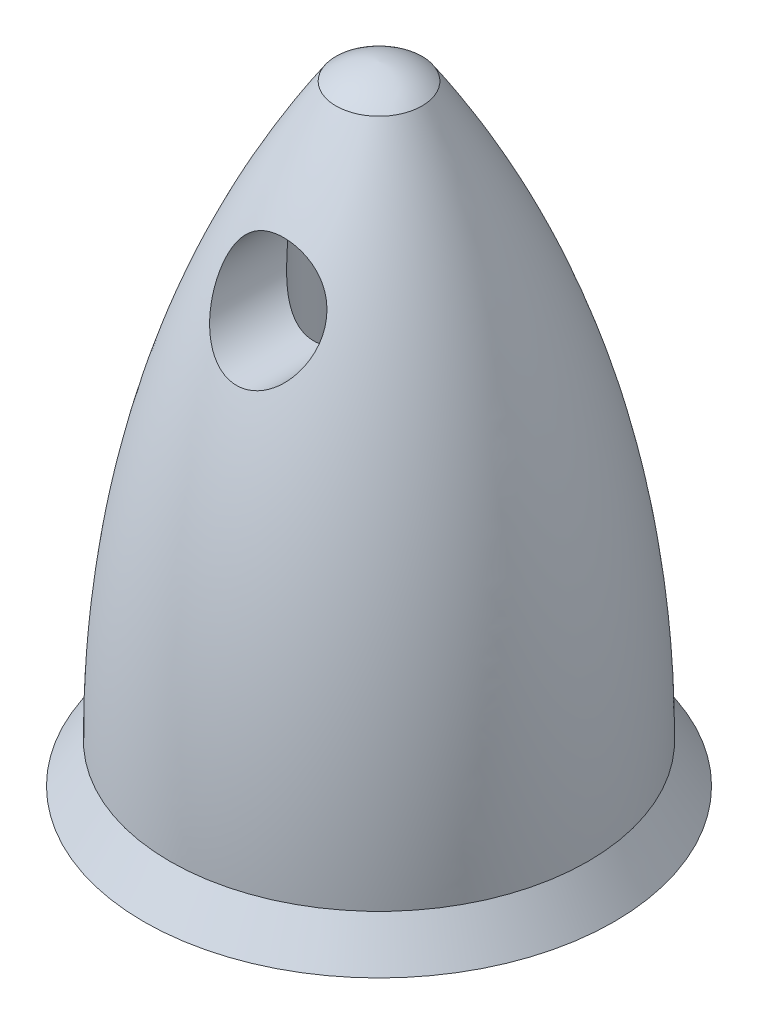
ISO-10303-21;
HEADER;
FILE_DESCRIPTION(('STEP AP214'),'2;1');
FILE_NAME('part.step','',(''),(''),'','','');
FILE_SCHEMA(('AUTOMOTIVE_DESIGN { 1 0 10303 214 1 1 1 1 }'));
ENDSEC;
DATA;
#1=APPLICATION_CONTEXT('core data for automotive mechanical design processes');
#2=APPLICATION_PROTOCOL_DEFINITION('international standard','automotive_design',2000,#1);
#3=PRODUCT_CONTEXT('',#1,'mechanical');
#4=PRODUCT('Part','Part','',(#3));
#5=PRODUCT_RELATED_PRODUCT_CATEGORY('part','',(#4));
#6=PRODUCT_DEFINITION_FORMATION('','',#4);
#7=PRODUCT_DEFINITION_CONTEXT('part definition',#1,'design');
#8=PRODUCT_DEFINITION('design','',#6,#7);
#9=PRODUCT_DEFINITION_SHAPE('','',#8);
#10=(LENGTH_UNIT() NAMED_UNIT(*) SI_UNIT(.MILLI.,.METRE.));
#11=(NAMED_UNIT(*) PLANE_ANGLE_UNIT() SI_UNIT($,.RADIAN.));
#12=(NAMED_UNIT(*) SI_UNIT($,.STERADIAN.) SOLID_ANGLE_UNIT());
#13=UNCERTAINTY_MEASURE_WITH_UNIT(LENGTH_MEASURE(1.E-05),#10,'distance_accuracy_value','');
#14=(GEOMETRIC_REPRESENTATION_CONTEXT(3) GLOBAL_UNCERTAINTY_ASSIGNED_CONTEXT((#13)) GLOBAL_UNIT_ASSIGNED_CONTEXT((#10,
#11,#12)) REPRESENTATION_CONTEXT('',''));
#15=CARTESIAN_POINT('',(0.,0.,0.));
#16=DIRECTION('',(0.,0.,1.));
#17=DIRECTION('',(1.,0.,0.));
#18=AXIS2_PLACEMENT_3D('',#15,#16,#17);
#19=CARTESIAN_POINT('',(8.,1.5,0.));
#20=CARTESIAN_POINT('',(8.00509837855469,13.8195255914153,0.));
#21=CARTESIAN_POINT('',(1.6474223451418,23.3622212906391,0.));
#22=B_SPLINE_CURVE_WITH_KNOTS('',2,(#19,#20,#21),.UNSPECIFIED.,.F.,.F.,(3,3),(0.,1.),.UNSPECIFIED.);
#23=CARTESIAN_POINT('',(0.,0.,0.));
#24=DIRECTION('',(0.,-1.,0.));
#25=AXIS1_PLACEMENT('',#23,#24);
#26=SURFACE_OF_REVOLUTION('',#22,#25);
#27=CARTESIAN_POINT('',(2.,18.,-4.16439047530531));
#28=CARTESIAN_POINT('',(2.00000132228339,17.8469787822175,-4.24087468113929));
#29=CARTESIAN_POINT('',(1.98246282334711,17.6965626129295,-4.32272335752828));
#30=CARTESIAN_POINT('',(1.9154314847744,17.4054283754849,-4.49069811409961));
#31=CARTESIAN_POINT('',(1.86587855210384,17.2647290974166,-4.57683195658075));
#32=CARTESIAN_POINT('',(1.74668213095308,17.0177303786333,-4.73405909875902));
#33=CARTESIAN_POINT('',(1.68136844887773,16.9094858955144,-4.80540597270987));
#34=CARTESIAN_POINT('',(1.52976705913139,16.705433609191,-4.94313214003216));
#35=CARTESIAN_POINT('',(1.44352897129227,16.6095971942849,-5.00952270671307));
#36=CARTESIAN_POINT('',(1.27190477751198,16.4531875226272,-5.11967526804636));
#37=CARTESIAN_POINT('',(1.19048897940305,16.3894918569217,-5.16520510695633));
#38=CARTESIAN_POINT('',(1.01584821919988,16.2740315302546,-5.24852193999172));
#39=CARTESIAN_POINT('',(0.92262637854601,16.2222637258074,-5.28631097384795));
#40=CARTESIAN_POINT('',(0.774879756223441,16.1554037623914,-5.33542264118872));
#41=CARTESIAN_POINT('',(0.724032967441554,16.1348392150353,-5.35058864972359));
#42=CARTESIAN_POINT('',(0.620131259246865,16.0977714319,-5.37799795020003));
#43=CARTESIAN_POINT('',(0.56707758730997,16.0812659371907,-5.39024286766301));
#44=CARTESIAN_POINT('',(0.459210590791025,16.0526336270831,-5.41152423037324));
#45=CARTESIAN_POINT('',(0.404398584574342,16.0405036108985,-5.42056302091203));
#46=CARTESIAN_POINT('',(0.293527429551626,16.0208545830147,-5.43522180714104));
#47=CARTESIAN_POINT('',(0.237468523548135,16.0133346816172,-5.44084246248981));
#48=CARTESIAN_POINT('',(0.0851747170856576,15.9995057356697,-5.45118115753812));
#49=CARTESIAN_POINT('',(-0.0117646068905049,15.9977136759196,-5.45252472761617));
#50=CARTESIAN_POINT('',(-0.204383137152047,16.0081305752898,-5.44473233648829));
#51=CARTESIAN_POINT('',(-0.300062642169775,16.020336152488,-5.43559890659504));
#52=CARTESIAN_POINT('',(-0.481561723050365,16.0567699852393,-5.40844226914602));
#53=CARTESIAN_POINT('',(-0.567626979742267,16.080221306521,-5.3909939418975));
#54=CARTESIAN_POINT('',(-0.734211398945126,16.1375548980061,-5.34856614152773));
#55=CARTESIAN_POINT('',(-0.814729420790609,16.1714393057539,-5.32358512512103));
#56=CARTESIAN_POINT('',(-0.975804814408148,16.2516840652165,-5.26485187490942));
#57=CARTESIAN_POINT('',(-1.05572621322973,16.2988871394051,-5.23051636617582));
#58=CARTESIAN_POINT('',(-1.20663385950139,16.4023665866032,-5.1560152662216));
#59=CARTESIAN_POINT('',(-1.27760119307123,16.4586616115647,-5.11583770741523));
#60=CARTESIAN_POINT('',(-1.42178174155163,16.5894601943292,-5.02368451216552));
#61=CARTESIAN_POINT('',(-1.49314281489147,16.6654209492791,-4.97088217216533));
#62=CARTESIAN_POINT('',(-1.62219024274386,16.825654992503,-4.86165980708384));
#63=CARTESIAN_POINT('',(-1.67988484004248,16.9099232265497,-4.80524198886428));
#64=CARTESIAN_POINT('',(-1.79093547516064,17.1016704475816,-4.6800187347082));
#65=CARTESIAN_POINT('',(-1.84149048840398,17.2105519053255,-4.61086038304109));
#66=CARTESIAN_POINT('',(-1.92258403447842,17.4360290691159,-4.47315291712996));
#67=CARTESIAN_POINT('',(-1.95309810555795,17.552634012059,-4.40460464779311));
#68=CARTESIAN_POINT('',(-1.9943464175847,17.8010194860405,-4.26610292105122));
#69=CARTESIAN_POINT('',(-2.0033661241953,17.933275964564,-4.19645164880046));
#70=CARTESIAN_POINT('',(-1.99662892741976,18.1339861357969,-4.09871043869333));
#71=CARTESIAN_POINT('',(-1.99101095160088,18.2012529726829,-4.06726255497447));
#72=CARTESIAN_POINT('',(-1.97273825672406,18.336047887372,-4.00712083409385));
#73=CARTESIAN_POINT('',(-1.96008648887651,18.4035758438231,-3.97842584779921));
#74=CARTESIAN_POINT('',(-1.91997433003718,18.5691140208107,-3.91189445242334));
#75=CARTESIAN_POINT('',(-1.88838458816037,18.6669115270029,-3.87589517661062));
#76=CARTESIAN_POINT('',(-1.80928357440446,18.8586212249348,-3.81217471943694));
#77=CARTESIAN_POINT('',(-1.76178592659663,18.9525366643494,-3.78444649275735));
#78=CARTESIAN_POINT('',(-1.65124669581154,19.1334183551623,-3.73750960758532));
#79=CARTESIAN_POINT('',(-1.58816877997912,19.2203677250402,-3.71832116098678));
#80=CARTESIAN_POINT('',(-1.44803016796994,19.3837628308006,-3.68772431972744));
#81=CARTESIAN_POINT('',(-1.37096433848802,19.4602046924643,-3.67631878859031));
#82=CARTESIAN_POINT('',(-1.20789819404141,19.5974873531949,-3.65977413291266));
#83=CARTESIAN_POINT('',(-1.12228380083369,19.6587650971307,-3.65443783312193));
#84=CARTESIAN_POINT('',(-0.942400605082832,19.7671768616643,-3.64736328812745));
#85=CARTESIAN_POINT('',(-0.848130787696554,19.8143092209519,-3.64562546540697));
#86=CARTESIAN_POINT('',(-0.648923898703459,19.8949831330995,-3.64384736503558));
#87=CARTESIAN_POINT('',(-0.543696978842256,19.9278116986371,-3.64388761506565));
#88=CARTESIAN_POINT('',(-0.329284591341105,19.9757639927752,-3.64428773733246));
#89=CARTESIAN_POINT('',(-0.220098840400272,19.9908864517074,-3.64464763248704));
#90=CARTESIAN_POINT('',(0.00179129571765312,20.0031526025608,-3.64492086455918));
#91=CARTESIAN_POINT('',(0.114519093560782,19.9998778406288,-3.64482381607894));
#92=CARTESIAN_POINT('',(0.337838693885028,19.9744614041814,-3.6443330142963));
#93=CARTESIAN_POINT('',(0.448430198915781,19.9523171214265,-3.64393921997707));
#94=CARTESIAN_POINT('',(0.664423624181753,19.8897599699488,-3.64401447240217));
#95=CARTESIAN_POINT('',(0.769821169617588,19.8493319832203,-3.64448423417086));
#96=CARTESIAN_POINT('',(0.972300540900261,19.7513640531198,-3.64825580546844));
#97=CARTESIAN_POINT('',(1.06938273265009,19.6938248631959,-3.65155749031289));
#98=CARTESIAN_POINT('',(1.25141016695183,19.5640765564659,-3.66335114247149));
#99=CARTESIAN_POINT('',(1.33646671312113,19.4920193381068,-3.67179106112054));
#100=CARTESIAN_POINT('',(1.49292488223481,19.3354429896482,-3.69604605717248));
#101=CARTESIAN_POINT('',(1.5643344934359,19.2509312014861,-3.71185680129151));
#102=CARTESIAN_POINT('',(1.68853749335672,19.0769109589441,-3.75133343181378));
#103=CARTESIAN_POINT('',(1.74204324559299,18.987818783171,-3.7745989987112));
#104=CARTESIAN_POINT('',(1.83391937752149,18.8045236280433,-3.82929070620194));
#105=CARTESIAN_POINT('',(1.87228892937118,18.7103203694694,-3.86071729298917));
#106=CARTESIAN_POINT('',(1.93599465733094,18.5132090785441,-3.93334256035601));
#107=CARTESIAN_POINT('',(1.9602520405581,18.4101481741056,-3.97506494689447));
#108=CARTESIAN_POINT('',(1.99226644643468,18.2043416075007,-4.06519363581308));
#109=CARTESIAN_POINT('',(1.99999912208554,18.1015966329021,-4.11360968885275));
#110=CARTESIAN_POINT('',(2.,18.,-4.16439047530531));
#111=B_SPLINE_CURVE_WITH_KNOTS('',3,(#27,#28,#29,#30,#31,#32,#33,#34,#35,#36,#37,#38,#39,#40,
#41,#42,#43,#44,#45,#46,#47,#48,#49,#50,#51,#52,#53,#54,#55,#56,#57,#58,#59,#60,#61,#62,#63,#64,
#65,#66,#67,#68,#69,#70,#71,#72,#73,#74,#75,#76,#77,#78,#79,#80,#81,#82,#83,#84,#85,#86,#87,#88,
#89,#90,#91,#92,#93,#94,#95,#96,#97,#98,#99,#100,#101,#102,#103,#104,#105,#106,#107,#108,#109,
#110),.UNSPECIFIED.,.T.,.F.,(4,2,2,2,2,2,2,2,2,2,2,2,2,2,2,2,2,2,2,2,2,2,2,2,2,2,2,2,2,2,2,2,2,
2,2,2,2,2,2,2,2,4),(0.,0.512607209641538,1.02617942069374,1.45978236052332,1.89236694109627,
2.22997179595971,2.56748757593189,2.7379875010266,2.90839232426471,3.07867223753792,
3.24891927841967,3.53811619725043,3.82724325890173,4.09877350508601,4.37035941980039,
4.66614860708941,4.96255249309127,5.31175976756855,5.6607558821214,6.07463889592299,
6.48902615649038,6.93550006316879,7.15857974688243,7.38156590227407,7.70674121026519,
8.03163873619365,8.35730119032,8.68308339906365,8.99794891449742,9.31285139497846,
9.64202960492138,9.97123141810797,10.3079509654721,10.6447170634484,10.9817621293277,
11.3187923564849,11.6524641005801,11.9859399270617,12.3038780716045,12.6218336026931,
12.9616727497734,13.3020122612191),.UNSPECIFIED.);
#112=CARTESIAN_POINT('',(2.,18.,-4.16439047530531));
#113=VERTEX_POINT('',#112);
#114=EDGE_CURVE('E113',#113,#113,#111,.T.);
#115=ORIENTED_EDGE('',*,*,#114,.F.);
#116=EDGE_LOOP('',(#115));
#117=FACE_BOUND('',#116,.T.);
#118=CARTESIAN_POINT('',(2.,18.,4.16439047530531));
#119=CARTESIAN_POINT('',(2.00000057944544,18.1046705265924,4.11207593826666));
#120=CARTESIAN_POINT('',(1.99179190525364,18.2106325166991,4.06222967269138));
#121=CARTESIAN_POINT('',(1.95770305813216,18.4229995013208,3.96966431253456));
#122=CARTESIAN_POINT('',(1.93182290252003,18.5294044954014,3.92694521096865));
#123=CARTESIAN_POINT('',(1.87909135460768,18.6871167051813,3.86954963119335));
#124=CARTESIAN_POINT('',(1.85909761035314,18.7395580718071,3.85147843005164));
#125=CARTESIAN_POINT('',(1.81443599300922,18.8432087680791,3.81777220655476));
#126=CARTESIAN_POINT('',(1.78977022179298,18.8944186401251,3.80213609443248));
#127=CARTESIAN_POINT('',(1.73582615973956,18.9950707499879,3.77338175218615));
#128=CARTESIAN_POINT('',(1.70654913914256,19.0445134700058,3.76026283086396));
#129=CARTESIAN_POINT('',(1.64354782047942,19.1410872163615,3.73651338629697));
#130=CARTESIAN_POINT('',(1.6098238853712,19.1882184309344,3.72588266016156));
#131=CARTESIAN_POINT('',(1.50906855713091,19.3167155561313,3.6993421630204));
#132=CARTESIAN_POINT('',(1.43717337913907,19.3949105460011,3.6861250126901));
#133=CARTESIAN_POINT('',(1.28144700107866,19.5392167925095,3.66603128043213));
#134=CARTESIAN_POINT('',(1.1976133205208,19.6053255314254,3.65915601839803));
#135=CARTESIAN_POINT('',(1.02051135841672,19.723326292481,3.64971132399764));
#136=CARTESIAN_POINT('',(0.927261973974762,19.7752460443959,3.64713344214322));
#137=CARTESIAN_POINT('',(0.733676852177356,19.8636112236442,3.64425152390731));
#138=CARTESIAN_POINT('',(0.633340418820009,19.9000551286608,3.64394771117094));
#139=CARTESIAN_POINT('',(0.423431878154422,19.9578271484812,3.64400672871137));
#140=CARTESIAN_POINT('',(0.313647245386074,19.9783859345727,3.64440075032844));
#141=CARTESIAN_POINT('',(0.0921855538740992,20.0009732775922,3.64485525949245));
#142=CARTESIAN_POINT('',(-0.0194916317821661,20.003000586853,3.64491572458195));
#143=CARTESIAN_POINT('',(-0.242760525574133,19.9883932858169,3.6445940066591));
#144=CARTESIAN_POINT('',(-0.354339887868319,19.9715692630952,3.64420732963983));
#145=CARTESIAN_POINT('',(-0.573110605654036,19.9194249006952,3.64387493479559));
#146=CARTESIAN_POINT('',(-0.680301213673639,19.8841014242894,3.64392929177406));
#147=CARTESIAN_POINT('',(-0.887223527306379,19.7959619157013,3.6462443546343));
#148=CARTESIAN_POINT('',(-0.986955073999633,19.7431455109515,3.64850510751029));
#149=CARTESIAN_POINT('',(-1.17598547752523,19.6216261271766,3.6575707371531));
#150=CARTESIAN_POINT('',(-1.2652876420994,19.5529282057788,3.66437416855834));
#151=CARTESIAN_POINT('',(-1.42874620182165,19.4037910653217,3.68467576366323));
#152=CARTESIAN_POINT('',(-1.50321202130364,19.3236695680334,3.69801103564212));
#153=CARTESIAN_POINT('',(-1.63740121287831,19.1535362206214,3.73294642295089));
#154=CARTESIAN_POINT('',(-1.69713104331637,19.0635287283208,3.75454290701478));
#155=CARTESIAN_POINT('',(-1.79828325359577,18.8812334003854,3.80538523247497));
#156=CARTESIAN_POINT('',(-1.8403956179723,18.7892202275757,3.8342526228187));
#157=CARTESIAN_POINT('',(-1.90975690838715,18.6023098785956,3.8994732021772));
#158=CARTESIAN_POINT('',(-1.93700049966853,18.5074116801841,3.93582907154263));
#159=CARTESIAN_POINT('',(-1.97807666446126,18.3124633981323,4.01675146606437));
#160=CARTESIAN_POINT('',(-1.99117011172331,18.2123930911849,4.06163776653939));
#161=CARTESIAN_POINT('',(-2.00242482756317,18.0138799105881,4.15650619241894));
#162=CARTESIAN_POINT('',(-2.00057970558377,17.9154377514889,4.20649048966182));
#163=CARTESIAN_POINT('',(-1.98148915445794,17.7059117721861,4.31813475014056));
#164=CARTESIAN_POINT('',(-1.96179994104439,17.5953600855232,4.38037518840548));
#165=CARTESIAN_POINT('',(-1.90472996288071,17.3799709285991,4.50675362748526));
#166=CARTESIAN_POINT('',(-1.8673300388181,17.2751397840744,4.57089361260197));
#167=CARTESIAN_POINT('',(-1.76892268002316,17.0581496910381,4.70780189953862));
#168=CARTESIAN_POINT('',(-1.70528926031475,16.9471129343147,4.78048111446553));
#169=CARTESIAN_POINT('',(-1.55633429077004,16.7373284175592,4.92126746263322));
#170=CARTESIAN_POINT('',(-1.47102966678373,16.6385711561284,4.98937811182076));
#171=CARTESIAN_POINT('',(-1.30062868872091,16.4772017063025,5.10261867899913));
#172=CARTESIAN_POINT('',(-1.21968222870932,16.41143082748,5.14949509820622));
#173=CARTESIAN_POINT('',(-1.04571884331071,16.2919105503448,5.23553361208601));
#174=CARTESIAN_POINT('',(-0.952718733901396,16.2381446832313,5.27470626608146));
#175=CARTESIAN_POINT('',(-0.770925952028576,16.1522413214949,5.33770874316154));
#176=CARTESIAN_POINT('',(-0.683590495451574,16.1180702733664,5.3629579723203));
#177=CARTESIAN_POINT('',(-0.503024896725797,16.0619894225595,5.40454081984399));
#178=CARTESIAN_POINT('',(-0.40979765108256,16.04007364637,5.42087878167675));
#179=CARTESIAN_POINT('',(-0.219558221909428,16.0097477127453,5.4435152580709));
#180=CARTESIAN_POINT('',(-0.122532366211017,16.0013920367419,5.4497732729243));
#181=CARTESIAN_POINT('',(0.0717985130394343,15.9989297165193,5.45161570923054));
#182=CARTESIAN_POINT('',(0.169103496181117,16.0048211043498,5.44720160482575));
#183=CARTESIAN_POINT('',(0.354206618137113,16.0295530219974,5.42872751234443));
#184=CARTESIAN_POINT('',(0.442199358661492,16.0474787557064,5.41534908073555));
#185=CARTESIAN_POINT('',(0.613500685551377,16.094348436027,5.38052688415284));
#186=CARTESIAN_POINT('',(0.69680843372731,16.1232943471006,5.35908168120064));
#187=CARTESIAN_POINT('',(0.861859862285189,16.1928788792993,5.30785331042936));
#188=CARTESIAN_POINT('',(0.943224520577523,16.2341042398367,5.27765451621789));
#189=CARTESIAN_POINT('',(1.09777286795813,16.3257897052851,5.21108456387765));
#190=CARTESIAN_POINT('',(1.17095323045242,16.3762535434562,5.17471091092793));
#191=CARTESIAN_POINT('',(1.31977559925573,16.4938142780752,5.09091578646054));
#192=CARTESIAN_POINT('',(1.39386225723834,16.5622816768418,5.04266040752597));
#193=CARTESIAN_POINT('',(1.52971737972815,16.7077582256207,4.94182791887858));
#194=CARTESIAN_POINT('',(1.59147368849789,16.7847756893974,4.88924661588809));
#195=CARTESIAN_POINT('',(1.71315292655853,16.9613828597757,4.77118419574597));
#196=CARTESIAN_POINT('',(1.77041255255113,17.0624576413004,4.70517464181589));
#197=CARTESIAN_POINT('',(1.86656532223051,17.272492226935,4.57247870996904));
#198=CARTESIAN_POINT('',(1.90546818058904,17.3814478251102,4.50579270916912));
#199=CARTESIAN_POINT('',(1.95615895427553,17.5750831265563,4.39234553272867));
#200=CARTESIAN_POINT('',(1.97244134788055,17.6583201093491,4.34509139898716));
#201=CARTESIAN_POINT('',(1.99436159288527,17.8274091164848,4.25279000977063));
#202=CARTESIAN_POINT('',(1.99999951982235,17.913261122266,4.20774273863704));
#203=CARTESIAN_POINT('',(2.,18.,4.16439047530531));
#204=B_SPLINE_CURVE_WITH_KNOTS('',3,(#118,#119,#120,#121,#122,#123,#124,#125,#126,#127,#128,
#129,#130,#131,#132,#133,#134,#135,#136,#137,#138,#139,#140,#141,#142,#143,#144,#145,#146,#147,
#148,#149,#150,#151,#152,#153,#154,#155,#156,#157,#158,#159,#160,#161,#162,#163,#164,#165,#166,
#167,#168,#169,#170,#171,#172,#173,#174,#175,#176,#177,#178,#179,#180,#181,#182,#183,#184,#185,
#186,#187,#188,#189,#190,#191,#192,#193,#194,#195,#196,#197,#198,#199,#200,#201,#202,#203),
.UNSPECIFIED.,.T.,.F.,(4,2,2,2,2,2,2,2,2,2,2,2,2,2,2,2,2,2,2,2,2,2,2,2,2,2,2,2,2,2,2,2,2,2,2,2,
2,2,2,2,2,2,4),(0.,0.350778535433807,0.70155672711489,0.878230720842534,1.05482541963119,
1.23137155747618,1.40790329450446,1.72733445909582,2.04683208970821,2.36570078146903,
2.68460083220942,3.01811651587726,3.35165465396365,3.68857437145553,4.02555123483176,
4.36253527566307,4.69941214803962,5.0282855897027,5.3570146388479,5.6712772506654,
5.98565254254989,6.31575568539903,6.64600005023663,7.02968505780081,7.41378608441201,
7.85325837850835,8.29238848140015,8.63412528174779,8.97539035797039,9.26552579335681,
9.55551968628986,9.84667585048834,10.1377917995142,10.4089634275842,10.680183417489,
10.9673278130385,11.2545885005231,11.5888370633332,11.9234135318027,12.3226817628884,
12.7217384577062,13.0124253722137,13.3031102238834),.UNSPECIFIED.);
#205=CARTESIAN_POINT('',(2.,18.,4.16439047530531));
#206=VERTEX_POINT('',#205);
#207=EDGE_CURVE('E108',#206,#206,#204,.T.);
#208=ORIENTED_EDGE('',*,*,#207,.F.);
#209=EDGE_LOOP('',(#208));
#210=FACE_BOUND('',#209,.T.);
#211=CARTESIAN_POINT('',(0.,23.3622212906391,0.));
#212=DIRECTION('',(0.,-1.,0.));
#213=DIRECTION('',(0.,0.,-1.));
#214=AXIS2_PLACEMENT_3D('',#211,#212,#213);
#215=CIRCLE('',#214,1.6474223451418);
#216=CARTESIAN_POINT('',(0.,23.3622212906391,-1.6474223451418));
#217=VERTEX_POINT('',#216);
#218=EDGE_CURVE('E73',#217,#217,#215,.T.);
#219=ORIENTED_EDGE('',*,*,#218,.T.);
#220=EDGE_LOOP('',(#219));
#221=FACE_BOUND('',#220,.T.);
#222=CARTESIAN_POINT('',(0.,1.5,0.));
#223=DIRECTION('',(0.,-1.,0.));
#224=DIRECTION('',(0.,0.,-1.));
#225=AXIS2_PLACEMENT_3D('',#222,#223,#224);
#226=CIRCLE('',#225,8.);
#227=CARTESIAN_POINT('',(0.,1.5,-8.));
#228=VERTEX_POINT('',#227);
#229=EDGE_CURVE('E81',#228,#228,#226,.T.);
#230=ORIENTED_EDGE('',*,*,#229,.F.);
#231=EDGE_LOOP('',(#230));
#232=FACE_BOUND('',#231,.T.);
#233=ADVANCED_FACE('F47',(#117,#210,#221,#232),#26,.F.);
#234=CARTESIAN_POINT('',(1.6474223451418,23.3622212906391,0.));
#235=CARTESIAN_POINT('',(0.928333000640494,23.9400151953652,0.));
#236=CARTESIAN_POINT('',(0.,24.,0.));
#237=B_SPLINE_CURVE_WITH_KNOTS('',2,(#234,#235,#236),.UNSPECIFIED.,.F.,.F.,(3,3),(0.,1.),.UNSPECIFIED.);
#238=CARTESIAN_POINT('',(0.,0.,0.));
#239=DIRECTION('',(0.,-1.,0.));
#240=AXIS1_PLACEMENT('',#238,#239);
#241=SURFACE_OF_REVOLUTION('',#237,#240);
#242=CARTESIAN_POINT('',(0.,24.,0.));
#243=VERTEX_POINT('',#242);
#244=VERTEX_LOOP('',#243);
#245=FACE_BOUND('',#244,.T.);
#246=ORIENTED_EDGE('',*,*,#218,.F.);
#247=EDGE_LOOP('',(#246));
#248=FACE_BOUND('',#247,.T.);
#249=ADVANCED_FACE('F67',(#245,#248),#241,.F.);
#250=CARTESIAN_POINT('',(0.,0.,0.));
#251=DIRECTION('',(0.,-1.,0.));
#252=DIRECTION('',(0.,0.,-1.));
#253=AXIS2_PLACEMENT_3D('',#250,#251,#252);
#254=PLANE('',#253);
#255=CARTESIAN_POINT('',(0.,0.,0.));
#256=DIRECTION('',(0.,-1.,0.));
#257=DIRECTION('',(0.,0.,-1.));
#258=AXIS2_PLACEMENT_3D('',#255,#256,#257);
#259=CIRCLE('',#258,3.00000000000002);
#260=CARTESIAN_POINT('',(0.,0.,-3.00000000000002));
#261=VERTEX_POINT('',#260);
#262=EDGE_CURVE('E11',#261,#261,#259,.F.);
#263=ORIENTED_EDGE('',*,*,#262,.T.);
#264=EDGE_LOOP('',(#263));
#265=FACE_BOUND('',#264,.T.);
#266=CARTESIAN_POINT('',(0.,0.,0.));
#267=DIRECTION('',(0.,-1.,0.));
#268=DIRECTION('',(0.,0.,-1.));
#269=AXIS2_PLACEMENT_3D('',#266,#267,#268);
#270=CIRCLE('',#269,9.);
#271=CARTESIAN_POINT('',(0.,0.,-9.));
#272=VERTEX_POINT('',#271);
#273=EDGE_CURVE('E80',#272,#272,#270,.T.);
#274=ORIENTED_EDGE('',*,*,#273,.T.);
#275=EDGE_LOOP('',(#274));
#276=FACE_BOUND('',#275,.T.);
#277=ADVANCED_FACE('F72',(#265,#276),#254,.T.);
#278=CARTESIAN_POINT('',(0.,1.5,0.));
#279=DIRECTION('',(0.,-1.,0.));
#280=DIRECTION('',(0.,0.,-1.));
#281=AXIS2_PLACEMENT_3D('',#278,#279,#280);
#282=CONICAL_SURFACE('',#281,8.,0.588002603547567);
#283=ORIENTED_EDGE('',*,*,#273,.F.);
#284=EDGE_LOOP('',(#283));
#285=FACE_BOUND('',#284,.T.);
#286=ORIENTED_EDGE('',*,*,#229,.T.);
#287=EDGE_LOOP('',(#286));
#288=FACE_BOUND('',#287,.T.);
#289=ADVANCED_FACE('F165',(#285,#288),#282,.T.);
#290=CARTESIAN_POINT('',(0.,21.,0.));
#291=DIRECTION('',(0.,-1.,0.));
#292=DIRECTION('',(0.,0.,-1.));
#293=AXIS2_PLACEMENT_3D('',#290,#291,#292);
#294=CYLINDRICAL_SURFACE('',#293,2.5);
#295=CARTESIAN_POINT('',(0.,20.,-2.5));
#296=CARTESIAN_POINT('',(0.0959968964388693,19.9999924205671,-2.49999264947401));
#297=CARTESIAN_POINT('',(0.192133192964674,19.9930305713364,-2.49441368411908));
#298=CARTESIAN_POINT('',(0.381319365477407,19.9656500599583,-2.47259269360604));
#299=CARTESIAN_POINT('',(0.474361934321336,19.9452016287381,-2.45632708000382));
#300=CARTESIAN_POINT('',(0.654094916824508,19.8923217211049,-2.4146672181517));
#301=CARTESIAN_POINT('',(0.740821698128049,19.8599666485686,-2.38933120144167));
#302=CARTESIAN_POINT('',(0.906926323692544,19.7848826565227,-2.33136010996601));
#303=CARTESIAN_POINT('',(0.986304144671505,19.7421537041494,-2.29872501207752));
#304=CARTESIAN_POINT('',(1.16318123656703,19.6313716349689,-2.21575664728951));
#305=CARTESIAN_POINT('',(1.25736767952115,19.5596810848259,-2.16321748603216));
#306=CARTESIAN_POINT('',(1.43041367827883,19.4027219342605,-2.05292192603027));
#307=CARTESIAN_POINT('',(1.50922761533153,19.3174142464966,-1.99515072200505));
#308=CARTESIAN_POINT('',(1.6521591895554,19.1332260159273,-1.87856001629835));
#309=CARTESIAN_POINT('',(1.71602638457222,19.0341532270239,-1.81973830902028));
#310=CARTESIAN_POINT('',(1.82646834413604,18.8234612174958,-1.7088210988299));
#311=CARTESIAN_POINT('',(1.87310099386401,18.711885666112,-1.65670347089169));
#312=CARTESIAN_POINT('',(1.93086043771819,18.526121048323,-1.58835652300928));
#313=CARTESIAN_POINT('',(1.94865475820658,18.4561882620197,-1.56628727770188));
#314=CARTESIAN_POINT('',(1.97673396798331,18.3127873158795,-1.53069889155832));
#315=CARTESIAN_POINT('',(1.98703731881776,18.239328326475,-1.5171587417974));
#316=CARTESIAN_POINT('',(1.99939840142554,18.089807481129,-1.50084234061103));
#317=CARTESIAN_POINT('',(2.00138345613423,18.0137285151792,-1.49816096926556));
#318=CARTESIAN_POINT('',(1.99669481699686,17.8622951079673,-1.50439962302809));
#319=CARTESIAN_POINT('',(1.99001379511087,17.7869413342337,-1.51332946660241));
#320=CARTESIAN_POINT('',(1.9669530271194,17.6277776973873,-1.5432072129997));
#321=CARTESIAN_POINT('',(1.94921808205621,17.544491993946,-1.56581842049528));
#322=CARTESIAN_POINT('',(1.90444547348848,17.383464440463,-1.61997459936279));
#323=CARTESIAN_POINT('',(1.87738025642251,17.3057398434602,-1.65154598198641));
#324=CARTESIAN_POINT('',(1.79974102194077,17.119337893959,-1.73656116159416));
#325=CARTESIAN_POINT('',(1.74414886595504,17.0141973016958,-1.79313372968153));
#326=CARTESIAN_POINT('',(1.61638467497537,16.8162833222007,-1.90913780060687));
#327=CARTESIAN_POINT('',(1.54418846902465,16.7235282791565,-1.96857337048937));
#328=CARTESIAN_POINT('',(1.38145818326396,16.5487252285949,-2.08612751968448));
#329=CARTESIAN_POINT('',(1.29048701026967,16.4670280776942,-2.14416889260779));
#330=CARTESIAN_POINT('',(1.09198491072667,16.3199005005657,-2.25171871494994));
#331=CARTESIAN_POINT('',(0.984499645201079,16.2544264838828,-2.3012499182245));
#332=CARTESIAN_POINT('',(0.78777781438056,16.1594371525901,-2.37424585643318));
#333=CARTESIAN_POINT('',(0.702177727329207,16.1249954955609,-2.40111071224171));
#334=CARTESIAN_POINT('',(0.524913923737154,16.067873549012,-2.44597564111417));
#335=CARTESIAN_POINT('',(0.433254836272285,16.0451843950545,-2.46398239496913));
#336=CARTESIAN_POINT('',(0.245713233844928,16.0128614530642,-2.48970335685206));
#337=CARTESIAN_POINT('',(0.149811307212617,16.003295875255,-2.49736378633666));
#338=CARTESIAN_POINT('',(-0.0426080028675179,15.9981409510237,-2.50148682701864));
#339=CARTESIAN_POINT('',(-0.139125268327963,16.0025490011779,-2.49795152409062));
#340=CARTESIAN_POINT('',(-0.321746674155463,16.0240828162477,-2.48076858642945));
#341=CARTESIAN_POINT('',(-0.408060891756566,16.040149175139,-2.46796352405063));
#342=CARTESIAN_POINT('',(-0.576335674228722,16.0828721811016,-2.43417513213473));
#343=CARTESIAN_POINT('',(-0.658294938856941,16.1095319710966,-2.41318937553438));
#344=CARTESIAN_POINT('',(-0.82123587754891,16.1741503717839,-2.36289849431328));
#345=CARTESIAN_POINT('',(-0.901843619419055,16.2127057859564,-2.33315912736867));
#346=CARTESIAN_POINT('',(-1.05541000448331,16.2988621516328,-2.26783622722139));
#347=CARTESIAN_POINT('',(-1.12836826593788,16.3464635542345,-2.23225240258423));
#348=CARTESIAN_POINT('',(-1.27925237569143,16.4592243182969,-2.14993687522397));
#349=CARTESIAN_POINT('',(-1.35550718978129,16.526001690483,-2.1023696976822));
#350=CARTESIAN_POINT('',(-1.4965368759753,16.669386961371,-2.00443497952019));
#351=CARTESIAN_POINT('',(-1.56127777727367,16.7460228368388,-1.95405970991097));
#352=CARTESIAN_POINT('',(-1.65568487930787,16.8764344432366,-1.87374135317135));
#353=CARTESIAN_POINT('',(-1.68913741792652,16.9273605907533,-1.84354743685463));
#354=CARTESIAN_POINT('',(-1.75155001920544,17.0326222614236,-1.78435415521131));
#355=CARTESIAN_POINT('',(-1.78050769868976,17.0869595718808,-1.75535542951891));
#356=CARTESIAN_POINT('',(-1.83358089959817,17.1988748402817,-1.69983828792997));
#357=CARTESIAN_POINT('',(-1.85771431687655,17.2564397672437,-1.67331090774834));
#358=CARTESIAN_POINT('',(-1.90088481958635,17.375008978504,-1.62410209867688));
#359=CARTESIAN_POINT('',(-1.9199255893155,17.4360107375195,-1.60141789380427));
#360=CARTESIAN_POINT('',(-1.95360165889083,17.5660867242378,-1.5601942022258));
#361=CARTESIAN_POINT('',(-1.96779559724999,17.6354226649403,-1.54209716714775));
#362=CARTESIAN_POINT('',(-1.98878905619367,17.7768376127381,-1.5149337159379));
#363=CARTESIAN_POINT('',(-1.99560723074758,17.8489092204505,-1.50584452307524));
#364=CARTESIAN_POINT('',(-2.00132058716546,17.9943487054641,-1.49824736779721));
#365=CARTESIAN_POINT('',(-2.0001731977979,18.0677214541542,-1.49979625918437));
#366=CARTESIAN_POINT('',(-1.98996519544204,18.2129841930231,-1.51330771695992));
#367=CARTESIAN_POINT('',(-1.98089203653787,18.2848716473261,-1.52528679347386));
#368=CARTESIAN_POINT('',(-1.95207745752715,18.4446067743446,-1.56207076756083));
#369=CARTESIAN_POINT('',(-1.93009230408643,18.5314230824911,-1.5894925841937));
#370=CARTESIAN_POINT('',(-1.87608177217432,18.6986334786896,-1.65288907642407));
#371=CARTESIAN_POINT('',(-1.84402681542564,18.7790077600367,-1.68888887211292));
#372=CARTESIAN_POINT('',(-1.78094746311468,18.9121777220462,-1.75491158724438));
#373=CARTESIAN_POINT('',(-1.7520236319041,18.9665191815183,-1.78388907325008));
#374=CARTESIAN_POINT('',(-1.68964733782463,19.0718382298173,-1.84307948739002));
#375=CARTESIAN_POINT('',(-1.65619322765903,19.1228145849511,-1.87329286211508));
#376=CARTESIAN_POINT('',(-1.54918435570711,19.2707794032988,-1.96437997758119));
#377=CARTESIAN_POINT('',(-1.4689854164051,19.3627986866625,-2.02569808481402));
#378=CARTESIAN_POINT('',(-1.29001718858431,19.5333894648308,-2.14418278787112));
#379=CARTESIAN_POINT('',(-1.19101966157648,19.6117702242368,-2.201284919641));
#380=CARTESIAN_POINT('',(-1.02998399899547,19.7155767294168,-2.27874650804527));
#381=CARTESIAN_POINT('',(-0.974255400199696,19.7478684441351,-2.30318868109329));
#382=CARTESIAN_POINT('',(-0.858854828628044,19.8073681009614,-2.34866115465602));
#383=CARTESIAN_POINT('',(-0.799185299805362,19.8345791544845,-2.36969354228912));
#384=CARTESIAN_POINT('',(-0.655037739424245,19.8917800598956,-2.41420905511499));
#385=CARTESIAN_POINT('',(-0.569110239590117,19.9194826718009,-2.43602892887628));
#386=CARTESIAN_POINT('',(-0.392713097427719,19.9631576733877,-2.47058864976841));
#387=CARTESIAN_POINT('',(-0.302256024103135,19.9791607887746,-2.48335227816872));
#388=CARTESIAN_POINT('',(-0.175880930919909,19.9925630255603,-2.49405378309104));
#389=CARTESIAN_POINT('',(-0.14080855282127,19.9953473787458,-2.49627918763429));
#390=CARTESIAN_POINT('',(-0.0704970748918266,19.9990674635275,-2.499253810179));
#391=CARTESIAN_POINT('',(-0.0352579397117335,20.0000027837899,-2.50000269971647));
#392=CARTESIAN_POINT('',(0.,20.,-2.5));
#393=B_SPLINE_CURVE_WITH_KNOTS('',3,(#295,#296,#297,#298,#299,#300,#301,#302,#303,#304,#305,
#306,#307,#308,#309,#310,#311,#312,#313,#314,#315,#316,#317,#318,#319,#320,#321,#322,#323,#324,
#325,#326,#327,#328,#329,#330,#331,#332,#333,#334,#335,#336,#337,#338,#339,#340,#341,#342,#343,
#344,#345,#346,#347,#348,#349,#350,#351,#352,#353,#354,#355,#356,#357,#358,#359,#360,#361,#362,
#363,#364,#365,#366,#367,#368,#369,#370,#371,#372,#373,#374,#375,#376,#377,#378,#379,#380,#381,
#382,#383,#384,#385,#386,#387,#388,#389,#390,#391,#392),.UNSPECIFIED.,.T.,.F.,(4,2,2,2,2,2,2,2,
2,2,2,2,2,2,2,2,2,2,2,2,2,2,2,2,2,2,2,2,2,2,2,2,2,2,2,2,2,2,2,2,2,2,2,2,2,2,2,2,4),(0.,
0.287836605992209,0.576310692639343,0.862965057250607,1.14962032997081,1.53607888200101,
1.92366738187851,2.31734741765481,2.70969292925127,2.9353448634113,3.1604387740811,
3.38749528500759,3.61474392028823,3.87758630032011,4.14121163495705,4.534257481883,
4.92787915886674,5.33198173288419,5.73498644040677,6.02213978124802,6.30907621738868,
6.59749843639965,6.88586692268771,7.1508700493816,7.41595185759573,7.69742753051566,
7.9789172435135,8.31365537249325,8.64936529970902,8.85316560745907,9.05707360380851,
9.26021055202079,9.46320013996582,9.68152133432597,9.89928907450685,10.1182215471168,
10.3375012031536,10.616933053181,10.8971934831173,11.1010640012511,11.3050088506911,
11.7129165318148,12.1261363563906,12.3324811048119,12.5386990694968,12.8161540735935,
13.0928777702216,13.1985714874516,13.3042887145431),.UNSPECIFIED.);
#394=CARTESIAN_POINT('',(0.,20.,-2.5));
#395=VERTEX_POINT('',#394);
#396=EDGE_CURVE('E53',#395,#395,#393,.T.);
#397=ORIENTED_EDGE('',*,*,#396,.T.);
#398=EDGE_LOOP('',(#397));
#399=FACE_BOUND('',#398,.T.);
#400=CARTESIAN_POINT('',(2.,18.,1.5));
#401=CARTESIAN_POINT('',(1.9999899563842,18.0750810173886,1.5000227575991));
#402=CARTESIAN_POINT('',(1.99572243014959,18.1502789260936,1.50575588676017));
#403=CARTESIAN_POINT('',(1.97904350434638,18.2983145294296,1.52759797098302));
#404=CARTESIAN_POINT('',(1.96660415938923,18.3711432218121,1.54374252679463));
#405=CARTESIAN_POINT('',(1.9288828901246,18.5376054195086,1.59078313764401));
#406=CARTESIAN_POINT('',(1.90063587852784,18.6296425070995,1.62485949442394));
#407=CARTESIAN_POINT('',(1.83286412912235,18.8059681401613,1.70094533012843));
#408=CARTESIAN_POINT('',(1.79330760683741,18.8902339496671,1.74297705283045));
#409=CARTESIAN_POINT('',(1.68777756612173,19.0803396567805,1.84624966659378));
#410=CARTESIAN_POINT('',(1.61742363711761,19.1829665741273,1.90894188114929));
#411=CARTESIAN_POINT('',(1.4586193506474,19.3739768352122,2.03287996747903));
#412=CARTESIAN_POINT('',(1.37018407682201,19.4623719421139,2.0941269976447));
#413=CARTESIAN_POINT('',(1.19476026278806,19.6071049195775,2.1979067439451));
#414=CARTESIAN_POINT('',(1.11093376146689,19.6663262826841,2.24174680788007));
#415=CARTESIAN_POINT('',(0.932444755507561,19.7723659599663,2.32165152523267));
#416=CARTESIAN_POINT('',(0.837799422094948,19.8192035482009,2.35772824500368));
#417=CARTESIAN_POINT('',(0.655317082222546,19.8917129605807,2.41415644696378));
#418=CARTESIAN_POINT('',(0.568853585755692,19.9195825645761,2.43610736091393));
#419=CARTESIAN_POINT('',(0.391188052921989,19.963498695254,2.47085912284979));
#420=CARTESIAN_POINT('',(0.29998863731262,19.97955168791,2.48366497483986));
#421=CARTESIAN_POINT('',(0.115048335136524,19.9988580932901,2.49907968883617));
#422=CARTESIAN_POINT('',(0.021299771372698,20.0020671926886,2.50165324772141));
#423=CARTESIAN_POINT('',(-0.165416366428144,19.9953357651278,2.49626936144757));
#424=CARTESIAN_POINT('',(-0.258383904122236,19.9853946296315,2.48831142893578));
#425=CARTESIAN_POINT('',(-0.435683568436101,19.953932013687,2.4632836571348));
#426=CARTESIAN_POINT('',(-0.520210188917501,19.9330711830439,2.44673404857181));
#427=CARTESIAN_POINT('',(-0.684171862172429,19.8813047657478,2.40604493660584));
#428=CARTESIAN_POINT('',(-0.763605624129772,19.8503966445024,2.38190351809567));
#429=CARTESIAN_POINT('',(-0.923527318234435,19.7763993014115,2.32486221996811));
#430=CARTESIAN_POINT('',(-1.00337969293305,19.7324234839853,2.29134265660255));
#431=CARTESIAN_POINT('',(-1.15470891362336,19.6354621404083,2.21894043646479));
#432=CARTESIAN_POINT('',(-1.22618103296473,19.5824715706369,2.18005477975511));
#433=CARTESIAN_POINT('',(-1.37426521356107,19.4569381312012,2.09053510980241));
#434=CARTESIAN_POINT('',(-1.44890108738507,19.3826163857951,2.03913144290366));
#435=CARTESIAN_POINT('',(-1.58538384993671,19.2237440963493,1.9349237792571));
#436=CARTESIAN_POINT('',(-1.64721494436041,19.1391811213257,1.88211814269102));
#437=CARTESIAN_POINT('',(-1.75228528490805,18.9687798041821,1.78441317626436));
#438=CARTESIAN_POINT('',(-1.79674173995946,18.8838490594863,1.73924224553799));
#439=CARTESIAN_POINT('',(-1.87389106987979,18.7056335336655,1.65582105773208));
#440=CARTESIAN_POINT('',(-1.90660965872838,18.6123675796624,1.61755576516689));
#441=CARTESIAN_POINT('',(-1.95062199735974,18.4472083959723,1.56393805143324));
#442=CARTESIAN_POINT('',(-1.96540293714784,18.3773871691021,1.54515601955456));
#443=CARTESIAN_POINT('',(-1.98746978122375,18.2348197940459,1.51667304681101));
#444=CARTESIAN_POINT('',(-1.99477239579985,18.1620805460893,1.50695186390373));
#445=CARTESIAN_POINT('',(-2.0012999442642,18.0151366220726,1.49827790293909));
#446=CARTESIAN_POINT('',(-2.00047806264257,17.9409259149426,1.49938753445573));
#447=CARTESIAN_POINT('',(-1.99072610261057,17.7939526749626,1.51230456185752));
#448=CARTESIAN_POINT('',(-1.98178458332099,17.7211923336125,1.52412705251965));
#449=CARTESIAN_POINT('',(-1.95331430449204,17.5609367973382,1.56051508430773));
#450=CARTESIAN_POINT('',(-1.9316709289088,17.4744017318692,1.58755721486228));
#451=CARTESIAN_POINT('',(-1.87841388450525,17.3077091339145,1.65022809339807));
#452=CARTESIAN_POINT('',(-1.84677049067316,17.2275715190969,1.6858823654909));
#453=CARTESIAN_POINT('',(-1.75807608919816,17.0384710706507,1.77903249993889));
#454=CARTESIAN_POINT('',(-1.69602510944931,16.9331046656748,1.83905564347523));
#455=CARTESIAN_POINT('',(-1.55438039564658,16.735615850758,1.96026853157683));
#456=CARTESIAN_POINT('',(-1.47476601547362,16.6435092403165,2.02145957104429));
#457=CARTESIAN_POINT('',(-1.29702304107542,16.472537192655,2.13993299259157));
#458=CARTESIAN_POINT('',(-1.19864860522964,16.3938773708869,2.1971478825966));
#459=CARTESIAN_POINT('',(-0.984970277741331,16.2547334725558,2.30083046289374));
#460=CARTESIAN_POINT('',(-0.869723203455204,16.1941903943294,2.3473329244064));
#461=CARTESIAN_POINT('',(-0.664531994140986,16.1115094125331,2.41163161860482));
#462=CARTESIAN_POINT('',(-0.578408265123348,16.0832826230259,2.43384921549885));
#463=CARTESIAN_POINT('',(-0.401365381235645,16.038567865036,2.46921550391513));
#464=CARTESIAN_POINT('',(-0.310449944179073,16.0220709354594,2.48237111815072));
#465=CARTESIAN_POINT('',(-0.125961358052317,16.0018071758953,2.49854699723994));
#466=CARTESIAN_POINT('',(-0.0323797561454624,15.9980867949417,2.50153028039159));
#467=CARTESIAN_POINT('',(0.154129494971541,16.0037665092652,2.4969871999336));
#468=CARTESIAN_POINT('',(0.247057097671177,16.0131675284083,2.48946009629711));
#469=CARTESIAN_POINT('',(0.424484983307834,16.0436035470912,2.46524008405095));
#470=CARTESIAN_POINT('',(0.509170159101605,16.0639893314028,2.44905900306101));
#471=CARTESIAN_POINT('',(0.673520542356736,16.1148534213135,2.40905201963011));
#472=CARTESIAN_POINT('',(0.753184443303518,16.145334340826,2.3852241372675));
#473=CARTESIAN_POINT('',(0.913383591851861,16.2183745443926,2.32886203207214));
#474=CARTESIAN_POINT('',(0.993310088153965,16.261793842111,2.29572397002092));
#475=CARTESIAN_POINT('',(1.14486396126305,16.3576423370946,2.22403396009593));
#476=CARTESIAN_POINT('',(1.21648689776308,16.4100763180685,2.18547913977516));
#477=CARTESIAN_POINT('',(1.36488223995397,16.5342962130037,2.0966685242987));
#478=CARTESIAN_POINT('',(1.4397080379364,16.6078464133154,2.04563299169992));
#479=CARTESIAN_POINT('',(1.5766935307999,16.7651169255234,1.9420131292006));
#480=CARTESIAN_POINT('',(1.63883728583053,16.8488498276053,1.88942694411834));
#481=CARTESIAN_POINT('',(1.7455126136634,17.0189575445296,1.79109125321811));
#482=CARTESIAN_POINT('',(1.79106140064658,17.1045725212161,1.74513263017548));
#483=CARTESIAN_POINT('',(1.87016304685231,17.2843918882514,1.66007449903139));
#484=CARTESIAN_POINT('',(1.90373836359645,17.3785797780377,1.6209622208173));
#485=CARTESIAN_POINT('',(1.94914139922438,17.5461393267527,1.56580101941138));
#486=CARTESIAN_POINT('',(1.96446470848963,17.6174195444072,1.54635220628734));
#487=CARTESIAN_POINT('',(1.98726282623961,17.7630242709709,1.51695472225641));
#488=CARTESIAN_POINT('',(1.99476751139893,17.8373360552779,1.50696990066825));
#489=CARTESIAN_POINT('',(1.99935742227831,17.9413252143423,1.50085460132402));
#490=CARTESIAN_POINT('',(2.00000392566845,17.9706536782435,1.49999110491774));
#491=CARTESIAN_POINT('',(2.,18.,1.5));
#492=B_SPLINE_CURVE_WITH_KNOTS('',3,(#400,#401,#402,#403,#404,#405,#406,#407,#408,#409,#410,
#411,#412,#413,#414,#415,#416,#417,#418,#419,#420,#421,#422,#423,#424,#425,#426,#427,#428,#429,
#430,#431,#432,#433,#434,#435,#436,#437,#438,#439,#440,#441,#442,#443,#444,#445,#446,#447,#448,
#449,#450,#451,#452,#453,#454,#455,#456,#457,#458,#459,#460,#461,#462,#463,#464,#465,#466,#467,
#468,#469,#470,#471,#472,#473,#474,#475,#476,#477,#478,#479,#480,#481,#482,#483,#484,#485,#486,
#487,#488,#489,#490,#491),.UNSPECIFIED.,.T.,.F.,(4,2,2,2,2,2,2,2,2,2,2,2,2,2,2,2,2,2,2,2,2,2,2,
2,2,2,2,2,2,2,2,2,2,2,2,2,2,2,2,2,2,2,2,2,2,4),(0.,0.225140818813293,0.451055593895016,
0.755714384660879,1.06123795594964,1.47720804611674,1.8928325353688,2.22639303179098,
2.55943127851025,2.83862094435178,3.1176577256094,3.39765639927928,3.67766803055209,
3.94241917501297,4.20723715914626,4.49756510688428,4.78805602626153,5.13841226546405,
5.48919811771067,5.80619193384967,6.12248701337037,6.34307726284837,6.56317352160417,
6.78453876949455,7.00621641426759,7.28428560377194,7.56318925297414,7.96975811975666,
8.3768074872857,8.78961174948153,9.20105660259844,9.47985927613151,9.75844872724252,
10.0380499218877,10.3176708039936,10.5823344198312,10.8470666181456,11.1364335884202,
11.4259545900794,11.7747351905783,12.1239515037794,12.4449574092071,12.7653580273015,
12.9909138326702,13.2156045429056,13.3036035490356),.UNSPECIFIED.);
#493=CARTESIAN_POINT('',(2.,18.,1.5));
#494=VERTEX_POINT('',#493);
#495=EDGE_CURVE('E86',#494,#494,#492,.T.);
#496=ORIENTED_EDGE('',*,*,#495,.T.);
#497=EDGE_LOOP('',(#496));
#498=FACE_BOUND('',#497,.T.);
#499=CARTESIAN_POINT('',(0.,0.500000000000025,0.));
#500=DIRECTION('',(0.,-1.,0.));
#501=DIRECTION('',(0.,0.,-1.));
#502=AXIS2_PLACEMENT_3D('',#499,#500,#501);
#503=CIRCLE('',#502,2.5);
#504=CARTESIAN_POINT('',(0.,0.500000000000025,-2.5));
#505=VERTEX_POINT('',#504);
#506=EDGE_CURVE('E63',#505,#505,#503,.T.);
#507=ORIENTED_EDGE('',*,*,#506,.T.);
#508=EDGE_LOOP('',(#507));
#509=FACE_BOUND('',#508,.T.);
#510=CARTESIAN_POINT('',(0.,21.,0.));
#511=DIRECTION('',(0.,-1.,0.));
#512=DIRECTION('',(0.,0.,-1.));
#513=AXIS2_PLACEMENT_3D('',#510,#511,#512);
#514=CIRCLE('',#513,2.5);
#515=CARTESIAN_POINT('',(0.,21.,-2.5));
#516=VERTEX_POINT('',#515);
#517=EDGE_CURVE('E128',#516,#516,#514,.T.);
#518=ORIENTED_EDGE('',*,*,#517,.F.);
#519=EDGE_LOOP('',(#518));
#520=FACE_BOUND('',#519,.T.);
#521=ADVANCED_FACE('F94',(#399,#498,#509,#520),#294,.F.);
#522=CARTESIAN_POINT('',(0.,21.,0.));
#523=DIRECTION('',(0.,-1.,0.));
#524=DIRECTION('',(0.,0.,-1.));
#525=AXIS2_PLACEMENT_3D('',#522,#523,#524);
#526=PLANE('',#525);
#527=ORIENTED_EDGE('',*,*,#517,.T.);
#528=EDGE_LOOP('',(#527));
#529=FACE_BOUND('',#528,.T.);
#530=ADVANCED_FACE('F103',(#529),#526,.T.);
#531=CARTESIAN_POINT('',(0.,0.500000000000025,0.));
#532=DIRECTION('',(0.,-1.,0.));
#533=DIRECTION('',(0.,0.,-1.));
#534=AXIS2_PLACEMENT_3D('',#531,#532,#533);
#535=CONICAL_SURFACE('',#534,2.5,0.785398163397447);
#536=ORIENTED_EDGE('',*,*,#262,.F.);
#537=EDGE_LOOP('',(#536));
#538=FACE_BOUND('',#537,.T.);
#539=ORIENTED_EDGE('',*,*,#506,.F.);
#540=EDGE_LOOP('',(#539));
#541=FACE_BOUND('',#540,.T.);
#542=ADVANCED_FACE('F55',(#538,#541),#535,.F.);
#543=CARTESIAN_POINT('',(0.,18.,-9.));
#544=DIRECTION('',(0.,0.,1.));
#545=DIRECTION('',(1.,0.,0.));
#546=AXIS2_PLACEMENT_3D('',#543,#544,#545);
#547=CYLINDRICAL_SURFACE('',#546,2.);
#548=ORIENTED_EDGE('',*,*,#207,.T.);
#549=EDGE_LOOP('',(#548));
#550=FACE_BOUND('',#549,.T.);
#551=ORIENTED_EDGE('',*,*,#495,.F.);
#552=EDGE_LOOP('',(#551));
#553=FACE_BOUND('',#552,.T.);
#554=ADVANCED_FACE('F101',(#550,#553),#547,.F.);
#555=ORIENTED_EDGE('',*,*,#114,.T.);
#556=EDGE_LOOP('',(#555));
#557=FACE_BOUND('',#556,.T.);
#558=ORIENTED_EDGE('',*,*,#396,.F.);
#559=EDGE_LOOP('',(#558));
#560=FACE_BOUND('',#559,.T.);
#561=ADVANCED_FACE('F98',(#557,#560),#547,.F.);
#562=CLOSED_SHELL('',(#233,#249,#277,#289,#521,#530,#542,#554,#561));
#563=MANIFOLD_SOLID_BREP('B2',#562);
#564=ADVANCED_BREP_SHAPE_REPRESENTATION('',(#18,#563),#14);
#565=SHAPE_DEFINITION_REPRESENTATION(#9,#564);
ENDSEC;
END-ISO-10303-21;
